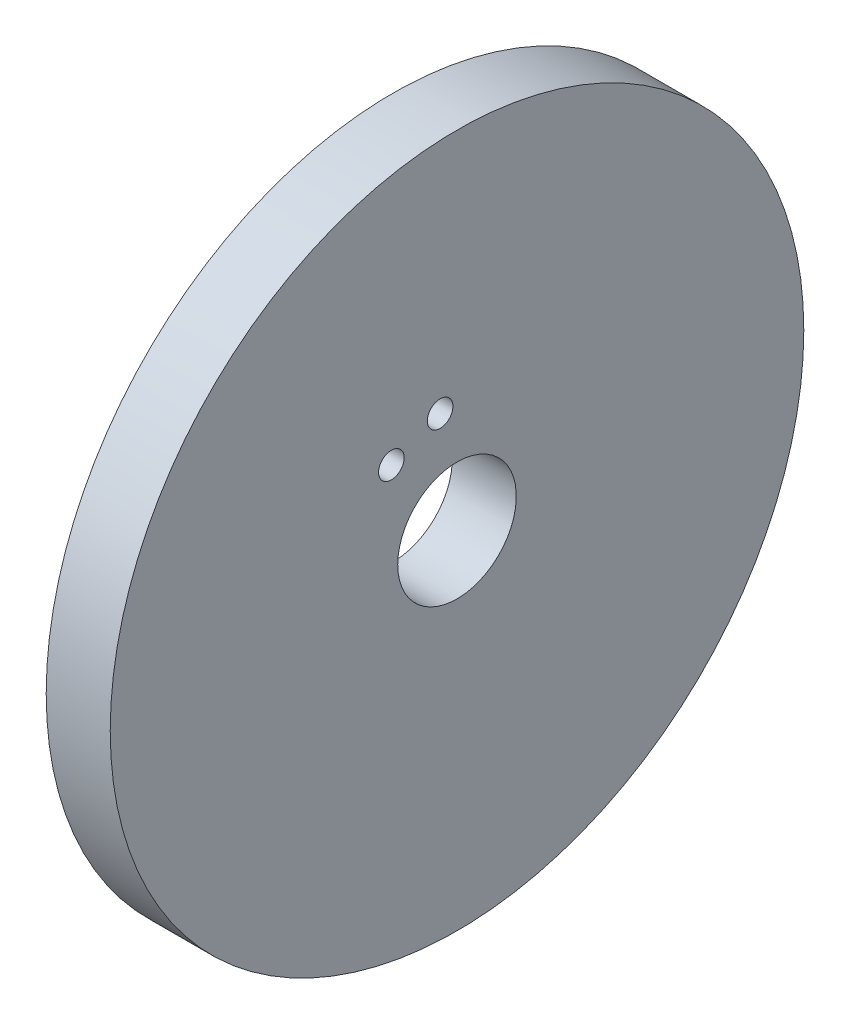
ISO-10303-21;
HEADER;
FILE_DESCRIPTION(('STEP AP214'),'2;1');
FILE_NAME('part.step','',(''),(''),'','','');
FILE_SCHEMA(('AUTOMOTIVE_DESIGN { 1 0 10303 214 1 1 1 1 }'));
ENDSEC;
DATA;
#1=APPLICATION_CONTEXT('core data for automotive mechanical design processes');
#2=APPLICATION_PROTOCOL_DEFINITION('international standard','automotive_design',2000,#1);
#3=PRODUCT_CONTEXT('',#1,'mechanical');
#4=PRODUCT('Part','Part','',(#3));
#5=PRODUCT_RELATED_PRODUCT_CATEGORY('part','',(#4));
#6=PRODUCT_DEFINITION_FORMATION('','',#4);
#7=PRODUCT_DEFINITION_CONTEXT('part definition',#1,'design');
#8=PRODUCT_DEFINITION('design','',#6,#7);
#9=PRODUCT_DEFINITION_SHAPE('','',#8);
#10=(LENGTH_UNIT() NAMED_UNIT(*) SI_UNIT(.MILLI.,.METRE.));
#11=(NAMED_UNIT(*) PLANE_ANGLE_UNIT() SI_UNIT($,.RADIAN.));
#12=(NAMED_UNIT(*) SI_UNIT($,.STERADIAN.) SOLID_ANGLE_UNIT());
#13=UNCERTAINTY_MEASURE_WITH_UNIT(LENGTH_MEASURE(1.E-05),#10,'distance_accuracy_value','');
#14=(GEOMETRIC_REPRESENTATION_CONTEXT(3) GLOBAL_UNCERTAINTY_ASSIGNED_CONTEXT((#13)) GLOBAL_UNIT_ASSIGNED_CONTEXT((#10,
#11,#12)) REPRESENTATION_CONTEXT('',''));
#15=CARTESIAN_POINT('',(0.,0.,0.));
#16=DIRECTION('',(0.,0.,1.));
#17=DIRECTION('',(1.,0.,0.));
#18=AXIS2_PLACEMENT_3D('',#15,#16,#17);
#19=CARTESIAN_POINT('',(13.7,65.,0.));
#20=DIRECTION('',(1.,0.,0.));
#21=DIRECTION('',(0.,0.,-1.));
#22=AXIS2_PLACEMENT_3D('',#19,#20,#21);
#23=PLANE('',#22);
#24=CARTESIAN_POINT('',(13.7,31.8198051533946,-31.8198051533946));
#25=DIRECTION('',(1.,0.,0.));
#26=DIRECTION('',(0.,0.,-1.));
#27=AXIS2_PLACEMENT_3D('',#24,#25,#26);
#28=CIRCLE('',#27,1.25);
#29=CARTESIAN_POINT('',(13.7,31.8198051533946,-33.0698051533946));
#30=VERTEX_POINT('',#29);
#31=EDGE_CURVE('E69',#30,#30,#28,.T.);
#32=ORIENTED_EDGE('',*,*,#31,.T.);
#33=EDGE_LOOP('',(#32));
#34=FACE_BOUND('',#33,.T.);
#35=CARTESIAN_POINT('',(13.7,-31.8198051533946,-31.8198051533946));
#36=DIRECTION('',(1.,0.,0.));
#37=DIRECTION('',(0.,0.,-1.));
#38=AXIS2_PLACEMENT_3D('',#35,#36,#37);
#39=CIRCLE('',#38,1.25);
#40=CARTESIAN_POINT('',(13.7,-31.8198051533946,-33.0698051533946));
#41=VERTEX_POINT('',#40);
#42=EDGE_CURVE('E75',#41,#41,#39,.T.);
#43=ORIENTED_EDGE('',*,*,#42,.T.);
#44=EDGE_LOOP('',(#43));
#45=FACE_BOUND('',#44,.T.);
#46=CARTESIAN_POINT('',(13.7,-31.8198051533946,31.8198051533946));
#47=DIRECTION('',(1.,0.,0.));
#48=DIRECTION('',(0.,0.,-1.));
#49=AXIS2_PLACEMENT_3D('',#46,#47,#48);
#50=CIRCLE('',#49,1.25);
#51=CARTESIAN_POINT('',(13.7,-31.8198051533946,30.5698051533946));
#52=VERTEX_POINT('',#51);
#53=EDGE_CURVE('E81',#52,#52,#50,.T.);
#54=ORIENTED_EDGE('',*,*,#53,.T.);
#55=EDGE_LOOP('',(#54));
#56=FACE_BOUND('',#55,.T.);
#57=CARTESIAN_POINT('',(13.7,31.8198051533946,31.8198051533946));
#58=DIRECTION('',(1.,0.,0.));
#59=DIRECTION('',(0.,0.,-1.));
#60=AXIS2_PLACEMENT_3D('',#57,#58,#59);
#61=CIRCLE('',#60,1.25);
#62=CARTESIAN_POINT('',(13.7,31.8198051533946,30.5698051533946));
#63=VERTEX_POINT('',#62);
#64=EDGE_CURVE('E63',#63,#63,#61,.T.);
#65=ORIENTED_EDGE('',*,*,#64,.T.);
#66=EDGE_LOOP('',(#65));
#67=FACE_BOUND('',#66,.T.);
#68=CARTESIAN_POINT('',(13.7,20.5579739264658,3.16381226351266));
#69=DIRECTION('',(1.,0.,0.));
#70=DIRECTION('',(0.,0.,-1.));
#71=AXIS2_PLACEMENT_3D('',#68,#69,#70);
#72=CIRCLE('',#71,2.4);
#73=CARTESIAN_POINT('',(13.7,20.5579739264658,0.763812263512656));
#74=VERTEX_POINT('',#73);
#75=EDGE_CURVE('E50',#74,#74,#72,.F.);
#76=ORIENTED_EDGE('',*,*,#75,.F.);
#77=EDGE_LOOP('',(#76));
#78=FACE_BOUND('',#77,.T.);
#79=CARTESIAN_POINT('',(13.7,16.7738358767911,12.2995296649292));
#80=DIRECTION('',(1.,0.,0.));
#81=DIRECTION('',(0.,0.,-1.));
#82=AXIS2_PLACEMENT_3D('',#79,#80,#81);
#83=CIRCLE('',#82,2.4);
#84=CARTESIAN_POINT('',(13.7,16.7738358767911,9.89952966492923));
#85=VERTEX_POINT('',#84);
#86=EDGE_CURVE('E53',#85,#85,#83,.F.);
#87=ORIENTED_EDGE('',*,*,#86,.F.);
#88=EDGE_LOOP('',(#87));
#89=FACE_BOUND('',#88,.T.);
#90=CARTESIAN_POINT('',(13.7,0.,0.));
#91=DIRECTION('',(-1.,0.,0.));
#92=DIRECTION('',(0.,0.,1.));
#93=AXIS2_PLACEMENT_3D('',#90,#91,#92);
#94=CIRCLE('',#93,11.1125);
#95=CARTESIAN_POINT('',(13.7,0.,11.1125));
#96=VERTEX_POINT('',#95);
#97=EDGE_CURVE('E10',#96,#96,#94,.T.);
#98=ORIENTED_EDGE('',*,*,#97,.F.);
#99=EDGE_LOOP('',(#98));
#100=FACE_BOUND('',#99,.T.);
#101=CARTESIAN_POINT('',(13.7,0.,0.));
#102=DIRECTION('',(-1.,0.,0.));
#103=DIRECTION('',(0.,0.,1.));
#104=AXIS2_PLACEMENT_3D('',#101,#102,#103);
#105=CIRCLE('',#104,65.);
#106=CARTESIAN_POINT('',(13.7,0.,65.));
#107=VERTEX_POINT('',#106);
#108=EDGE_CURVE('E45',#107,#107,#105,.T.);
#109=ORIENTED_EDGE('',*,*,#108,.T.);
#110=EDGE_LOOP('',(#109));
#111=FACE_BOUND('',#110,.T.);
#112=ADVANCED_FACE('F31',(#34,#45,#56,#67,#78,#89,#100,#111),#23,.F.);
#113=CARTESIAN_POINT('',(-110.,0.,0.));
#114=DIRECTION('',(-1.,0.,0.));
#115=DIRECTION('',(0.,0.,1.));
#116=AXIS2_PLACEMENT_3D('',#113,#114,#115);
#117=CYLINDRICAL_SURFACE('',#116,11.1125);
#118=CARTESIAN_POINT('',(25.7,0.,0.));
#119=DIRECTION('',(-1.,0.,0.));
#120=DIRECTION('',(0.,0.,1.));
#121=AXIS2_PLACEMENT_3D('',#118,#119,#120);
#122=CIRCLE('',#121,11.1125);
#123=CARTESIAN_POINT('',(25.7,0.,11.1125));
#124=VERTEX_POINT('',#123);
#125=EDGE_CURVE('E37',#124,#124,#122,.T.);
#126=ORIENTED_EDGE('',*,*,#125,.F.);
#127=EDGE_LOOP('',(#126));
#128=FACE_BOUND('',#127,.T.);
#129=ORIENTED_EDGE('',*,*,#97,.T.);
#130=EDGE_LOOP('',(#129));
#131=FACE_BOUND('',#130,.T.);
#132=ADVANCED_FACE('F104',(#128,#131),#117,.F.);
#133=CARTESIAN_POINT('',(25.7,11.1125,0.));
#134=DIRECTION('',(-1.,0.,0.));
#135=DIRECTION('',(0.,0.,1.));
#136=AXIS2_PLACEMENT_3D('',#133,#134,#135);
#137=PLANE('',#136);
#138=CARTESIAN_POINT('',(25.7,20.5579739264658,3.16381226351266));
#139=DIRECTION('',(1.,0.,0.));
#140=DIRECTION('',(0.,0.,-1.));
#141=AXIS2_PLACEMENT_3D('',#138,#139,#140);
#142=CIRCLE('',#141,2.4);
#143=CARTESIAN_POINT('',(25.7,20.5579739264658,0.763812263512656));
#144=VERTEX_POINT('',#143);
#145=EDGE_CURVE('E56',#144,#144,#142,.T.);
#146=ORIENTED_EDGE('',*,*,#145,.F.);
#147=EDGE_LOOP('',(#146));
#148=FACE_BOUND('',#147,.T.);
#149=CARTESIAN_POINT('',(25.7,16.7738358767911,12.2995296649292));
#150=DIRECTION('',(1.,0.,0.));
#151=DIRECTION('',(0.,0.,-1.));
#152=AXIS2_PLACEMENT_3D('',#149,#150,#151);
#153=CIRCLE('',#152,2.4);
#154=CARTESIAN_POINT('',(25.7,16.7738358767911,9.89952966492923));
#155=VERTEX_POINT('',#154);
#156=EDGE_CURVE('E57',#155,#155,#153,.T.);
#157=ORIENTED_EDGE('',*,*,#156,.F.);
#158=EDGE_LOOP('',(#157));
#159=FACE_BOUND('',#158,.T.);
#160=CARTESIAN_POINT('',(25.7,0.,0.));
#161=DIRECTION('',(-1.,0.,0.));
#162=DIRECTION('',(0.,0.,1.));
#163=AXIS2_PLACEMENT_3D('',#160,#161,#162);
#164=CIRCLE('',#163,65.);
#165=CARTESIAN_POINT('',(25.7,0.,65.));
#166=VERTEX_POINT('',#165);
#167=EDGE_CURVE('E41',#166,#166,#164,.T.);
#168=ORIENTED_EDGE('',*,*,#167,.F.);
#169=EDGE_LOOP('',(#168));
#170=FACE_BOUND('',#169,.T.);
#171=ORIENTED_EDGE('',*,*,#125,.T.);
#172=EDGE_LOOP('',(#171));
#173=FACE_BOUND('',#172,.T.);
#174=ADVANCED_FACE('F109',(#148,#159,#170,#173),#137,.F.);
#175=CARTESIAN_POINT('',(-110.,0.,0.));
#176=DIRECTION('',(-1.,0.,0.));
#177=DIRECTION('',(0.,0.,1.));
#178=AXIS2_PLACEMENT_3D('',#175,#176,#177);
#179=CYLINDRICAL_SURFACE('',#178,65.);
#180=ORIENTED_EDGE('',*,*,#108,.F.);
#181=EDGE_LOOP('',(#180));
#182=FACE_BOUND('',#181,.T.);
#183=ORIENTED_EDGE('',*,*,#167,.T.);
#184=EDGE_LOOP('',(#183));
#185=FACE_BOUND('',#184,.T.);
#186=ADVANCED_FACE('F126',(#182,#185),#179,.T.);
#187=CARTESIAN_POINT('',(25.7,16.7738358767911,12.2995296649292));
#188=DIRECTION('',(-1.,0.,0.));
#189=DIRECTION('',(0.,0.,1.));
#190=AXIS2_PLACEMENT_3D('',#187,#188,#189);
#191=CYLINDRICAL_SURFACE('',#190,2.4);
#192=ORIENTED_EDGE('',*,*,#156,.T.);
#193=EDGE_LOOP('',(#192));
#194=FACE_BOUND('',#193,.T.);
#195=ORIENTED_EDGE('',*,*,#86,.T.);
#196=EDGE_LOOP('',(#195));
#197=FACE_BOUND('',#196,.T.);
#198=ADVANCED_FACE('F129',(#194,#197),#191,.F.);
#199=CARTESIAN_POINT('',(25.7,20.5579739264658,3.16381226351266));
#200=DIRECTION('',(-1.,0.,0.));
#201=DIRECTION('',(0.,0.,1.));
#202=AXIS2_PLACEMENT_3D('',#199,#200,#201);
#203=CYLINDRICAL_SURFACE('',#202,2.4);
#204=ORIENTED_EDGE('',*,*,#145,.T.);
#205=EDGE_LOOP('',(#204));
#206=FACE_BOUND('',#205,.T.);
#207=ORIENTED_EDGE('',*,*,#75,.T.);
#208=EDGE_LOOP('',(#207));
#209=FACE_BOUND('',#208,.T.);
#210=ADVANCED_FACE('F143',(#206,#209),#203,.F.);
#211=CARTESIAN_POINT('',(20.7,31.8198051533946,31.8198051533946));
#212=DIRECTION('',(-1.,0.,0.));
#213=DIRECTION('',(0.,0.,1.));
#214=AXIS2_PLACEMENT_3D('',#211,#212,#213);
#215=CYLINDRICAL_SURFACE('',#214,1.25);
#216=CARTESIAN_POINT('',(20.7,31.8198051533946,31.8198051533946));
#217=DIRECTION('',(1.,0.,0.));
#218=DIRECTION('',(0.,0.,-1.));
#219=AXIS2_PLACEMENT_3D('',#216,#217,#218);
#220=CIRCLE('',#219,1.25);
#221=CARTESIAN_POINT('',(20.7,31.8198051533946,30.5698051533946));
#222=VERTEX_POINT('',#221);
#223=EDGE_CURVE('E60',#222,#222,#220,.T.);
#224=ORIENTED_EDGE('',*,*,#223,.T.);
#225=EDGE_LOOP('',(#224));
#226=FACE_BOUND('',#225,.T.);
#227=ORIENTED_EDGE('',*,*,#64,.F.);
#228=EDGE_LOOP('',(#227));
#229=FACE_BOUND('',#228,.T.);
#230=ADVANCED_FACE('F147',(#226,#229),#215,.F.);
#231=CARTESIAN_POINT('',(20.7,31.8198051533946,31.8198051533946));
#232=DIRECTION('',(1.,0.,0.));
#233=DIRECTION('',(0.,0.,-1.));
#234=AXIS2_PLACEMENT_3D('',#231,#232,#233);
#235=PLANE('',#234);
#236=ORIENTED_EDGE('',*,*,#223,.F.);
#237=EDGE_LOOP('',(#236));
#238=FACE_BOUND('',#237,.T.);
#239=ADVANCED_FACE('F101',(#238),#235,.F.);
#240=CARTESIAN_POINT('',(20.7,-31.8198051533946,31.8198051533946));
#241=DIRECTION('',(-1.,0.,0.));
#242=DIRECTION('',(0.,0.,1.));
#243=AXIS2_PLACEMENT_3D('',#240,#241,#242);
#244=CYLINDRICAL_SURFACE('',#243,1.25);
#245=CARTESIAN_POINT('',(20.7,-31.8198051533946,31.8198051533946));
#246=DIRECTION('',(1.,0.,0.));
#247=DIRECTION('',(0.,0.,-1.));
#248=AXIS2_PLACEMENT_3D('',#245,#246,#247);
#249=CIRCLE('',#248,1.25);
#250=CARTESIAN_POINT('',(20.7,-31.8198051533946,30.5698051533946));
#251=VERTEX_POINT('',#250);
#252=EDGE_CURVE('E66',#251,#251,#249,.T.);
#253=ORIENTED_EDGE('',*,*,#252,.T.);
#254=EDGE_LOOP('',(#253));
#255=FACE_BOUND('',#254,.T.);
#256=ORIENTED_EDGE('',*,*,#53,.F.);
#257=EDGE_LOOP('',(#256));
#258=FACE_BOUND('',#257,.T.);
#259=ADVANCED_FACE('F87',(#255,#258),#244,.F.);
#260=CARTESIAN_POINT('',(20.7,-31.8198051533946,31.8198051533946));
#261=DIRECTION('',(1.,0.,0.));
#262=DIRECTION('',(0.,0.,-1.));
#263=AXIS2_PLACEMENT_3D('',#260,#261,#262);
#264=PLANE('',#263);
#265=ORIENTED_EDGE('',*,*,#252,.F.);
#266=EDGE_LOOP('',(#265));
#267=FACE_BOUND('',#266,.T.);
#268=ADVANCED_FACE('F90',(#267),#264,.F.);
#269=CARTESIAN_POINT('',(20.7,-31.8198051533946,-31.8198051533946));
#270=DIRECTION('',(-1.,0.,0.));
#271=DIRECTION('',(0.,0.,1.));
#272=AXIS2_PLACEMENT_3D('',#269,#270,#271);
#273=CYLINDRICAL_SURFACE('',#272,1.25);
#274=CARTESIAN_POINT('',(20.7,-31.8198051533946,-31.8198051533946));
#275=DIRECTION('',(1.,0.,0.));
#276=DIRECTION('',(0.,0.,-1.));
#277=AXIS2_PLACEMENT_3D('',#274,#275,#276);
#278=CIRCLE('',#277,1.25);
#279=CARTESIAN_POINT('',(20.7,-31.8198051533946,-33.0698051533946));
#280=VERTEX_POINT('',#279);
#281=EDGE_CURVE('E78',#280,#280,#278,.T.);
#282=ORIENTED_EDGE('',*,*,#281,.T.);
#283=EDGE_LOOP('',(#282));
#284=FACE_BOUND('',#283,.T.);
#285=ORIENTED_EDGE('',*,*,#42,.F.);
#286=EDGE_LOOP('',(#285));
#287=FACE_BOUND('',#286,.T.);
#288=ADVANCED_FACE('F92',(#284,#287),#273,.F.);
#289=CARTESIAN_POINT('',(20.7,-31.8198051533946,-31.8198051533946));
#290=DIRECTION('',(1.,0.,0.));
#291=DIRECTION('',(0.,0.,-1.));
#292=AXIS2_PLACEMENT_3D('',#289,#290,#291);
#293=PLANE('',#292);
#294=ORIENTED_EDGE('',*,*,#281,.F.);
#295=EDGE_LOOP('',(#294));
#296=FACE_BOUND('',#295,.T.);
#297=ADVANCED_FACE('F98',(#296),#293,.F.);
#298=CARTESIAN_POINT('',(20.7,31.8198051533946,-31.8198051533946));
#299=DIRECTION('',(-1.,0.,0.));
#300=DIRECTION('',(0.,0.,1.));
#301=AXIS2_PLACEMENT_3D('',#298,#299,#300);
#302=CYLINDRICAL_SURFACE('',#301,1.25);
#303=CARTESIAN_POINT('',(20.7,31.8198051533946,-31.8198051533946));
#304=DIRECTION('',(1.,0.,0.));
#305=DIRECTION('',(0.,0.,-1.));
#306=AXIS2_PLACEMENT_3D('',#303,#304,#305);
#307=CIRCLE('',#306,1.25);
#308=CARTESIAN_POINT('',(20.7,31.8198051533946,-33.0698051533946));
#309=VERTEX_POINT('',#308);
#310=EDGE_CURVE('E72',#309,#309,#307,.T.);
#311=ORIENTED_EDGE('',*,*,#310,.T.);
#312=EDGE_LOOP('',(#311));
#313=FACE_BOUND('',#312,.T.);
#314=ORIENTED_EDGE('',*,*,#31,.F.);
#315=EDGE_LOOP('',(#314));
#316=FACE_BOUND('',#315,.T.);
#317=ADVANCED_FACE('F155',(#313,#316),#302,.F.);
#318=CARTESIAN_POINT('',(20.7,31.8198051533946,-31.8198051533946));
#319=DIRECTION('',(1.,0.,0.));
#320=DIRECTION('',(0.,0.,-1.));
#321=AXIS2_PLACEMENT_3D('',#318,#319,#320);
#322=PLANE('',#321);
#323=ORIENTED_EDGE('',*,*,#310,.F.);
#324=EDGE_LOOP('',(#323));
#325=FACE_BOUND('',#324,.T.);
#326=ADVANCED_FACE('F158',(#325),#322,.F.);
#327=CLOSED_SHELL('',(#112,#132,#174,#186,#198,#210,#230,#239,#259,#268,#288,#297,#317,#326));
#328=MANIFOLD_SOLID_BREP('B2',#327);
#329=ADVANCED_BREP_SHAPE_REPRESENTATION('',(#18,#328),#14);
#330=SHAPE_DEFINITION_REPRESENTATION(#9,#329);
ENDSEC;
END-ISO-10303-21;
